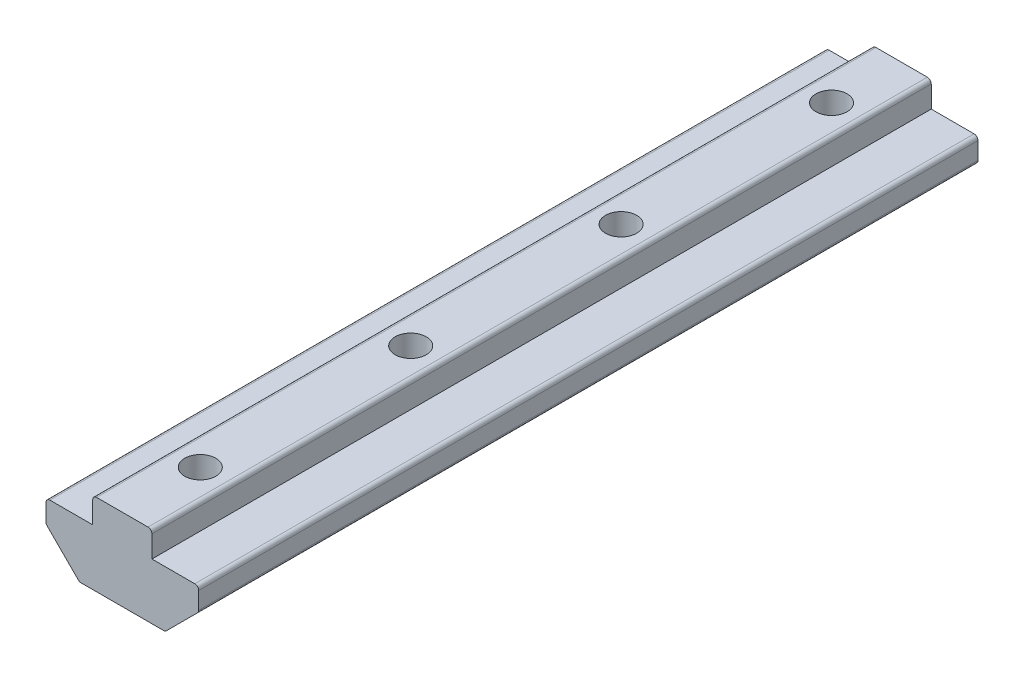
ISO-10303-21;
HEADER;
FILE_DESCRIPTION(('STEP AP214'),'2;1');
FILE_NAME('part.step','',(''),(''),'','','');
FILE_SCHEMA(('AUTOMOTIVE_DESIGN { 1 0 10303 214 1 1 1 1 }'));
ENDSEC;
DATA;
#1=APPLICATION_CONTEXT('core data for automotive mechanical design processes');
#2=APPLICATION_PROTOCOL_DEFINITION('international standard','automotive_design',2000,#1);
#3=PRODUCT_CONTEXT('',#1,'mechanical');
#4=PRODUCT('Part','Part','',(#3));
#5=PRODUCT_RELATED_PRODUCT_CATEGORY('part','',(#4));
#6=PRODUCT_DEFINITION_FORMATION('','',#4);
#7=PRODUCT_DEFINITION_CONTEXT('part definition',#1,'design');
#8=PRODUCT_DEFINITION('design','',#6,#7);
#9=PRODUCT_DEFINITION_SHAPE('','',#8);
#10=(LENGTH_UNIT() NAMED_UNIT(*) SI_UNIT(.MILLI.,.METRE.));
#11=(NAMED_UNIT(*) PLANE_ANGLE_UNIT() SI_UNIT($,.RADIAN.));
#12=(NAMED_UNIT(*) SI_UNIT($,.STERADIAN.) SOLID_ANGLE_UNIT());
#13=UNCERTAINTY_MEASURE_WITH_UNIT(LENGTH_MEASURE(1.E-05),#10,'distance_accuracy_value','');
#14=(GEOMETRIC_REPRESENTATION_CONTEXT(3) GLOBAL_UNCERTAINTY_ASSIGNED_CONTEXT((#13)) GLOBAL_UNIT_ASSIGNED_CONTEXT((#10,
#11,#12)) REPRESENTATION_CONTEXT('',''));
#15=CARTESIAN_POINT('',(0.,0.,0.));
#16=DIRECTION('',(0.,0.,1.));
#17=DIRECTION('',(1.,0.,0.));
#18=AXIS2_PLACEMENT_3D('',#15,#16,#17);
#19=CARTESIAN_POINT('',(19585.6814364039,-2632.55583535317,90.));
#20=DIRECTION('',(-5.38488611743923E-13,1.,0.));
#21=DIRECTION('',(-1.,-5.38488611743923E-13,0.));
#22=AXIS2_PLACEMENT_3D('',#19,#20,#21);
#23=CYLINDRICAL_SURFACE('',#22,2.00000000000001);
#24=CARTESIAN_POINT('',(19585.6814364008,3267.44416464683,90.));
#25=DIRECTION('',(-5.38488611743923E-13,1.,0.));
#26=DIRECTION('',(-1.,-5.38488611743923E-13,0.));
#27=AXIS2_PLACEMENT_3D('',#24,#25,#26);
#28=CIRCLE('',#27,2.00000000000001);
#29=CARTESIAN_POINT('',(19583.6814364008,3267.44416464683,90.));
#30=VERTEX_POINT('',#29);
#31=EDGE_CURVE('E64',#30,#30,#28,.T.);
#32=ORIENTED_EDGE('',*,*,#31,.T.);
#33=EDGE_LOOP('',(#32));
#34=FACE_BOUND('',#33,.T.);
#35=CARTESIAN_POINT('',(19585.6814364008,3256.94728629633,90.));
#36=DIRECTION('',(0.,1.,0.));
#37=DIRECTION('',(0.,0.,1.));
#38=AXIS2_PLACEMENT_3D('',#35,#36,#37);
#39=CIRCLE('',#38,2.00000000000001);
#40=CARTESIAN_POINT('',(19585.6814364008,3256.94728629633,92.));
#41=VERTEX_POINT('',#40);
#42=EDGE_CURVE('E11',#41,#41,#39,.T.);
#43=ORIENTED_EDGE('',*,*,#42,.F.);
#44=EDGE_LOOP('',(#43));
#45=FACE_BOUND('',#44,.T.);
#46=ADVANCED_FACE('F54',(#34,#45),#23,.F.);
#47=CARTESIAN_POINT('',(19585.6814364039,-2632.55583535317,63.));
#48=DIRECTION('',(-5.38488611743923E-13,1.,0.));
#49=DIRECTION('',(-1.,-5.38488611743923E-13,0.));
#50=AXIS2_PLACEMENT_3D('',#47,#48,#49);
#51=CYLINDRICAL_SURFACE('',#50,2.00000000000001);
#52=CARTESIAN_POINT('',(19585.6814364008,3267.44416464683,63.));
#53=DIRECTION('',(-5.38488611743923E-13,1.,0.));
#54=DIRECTION('',(-1.,-5.38488611743923E-13,0.));
#55=AXIS2_PLACEMENT_3D('',#52,#53,#54);
#56=CIRCLE('',#55,2.00000000000001);
#57=CARTESIAN_POINT('',(19583.6814364008,3267.44416464683,63.));
#58=VERTEX_POINT('',#57);
#59=EDGE_CURVE('E206',#58,#58,#56,.T.);
#60=ORIENTED_EDGE('',*,*,#59,.T.);
#61=EDGE_LOOP('',(#60));
#62=FACE_BOUND('',#61,.T.);
#63=CARTESIAN_POINT('',(19585.6814364008,3256.94728629633,63.));
#64=DIRECTION('',(0.,1.,0.));
#65=DIRECTION('',(0.,0.,1.));
#66=AXIS2_PLACEMENT_3D('',#63,#64,#65);
#67=CIRCLE('',#66,2.00000000000001);
#68=CARTESIAN_POINT('',(19585.6814364008,3256.94728629633,65.));
#69=VERTEX_POINT('',#68);
#70=EDGE_CURVE('E350',#69,#69,#67,.T.);
#71=ORIENTED_EDGE('',*,*,#70,.F.);
#72=EDGE_LOOP('',(#71));
#73=FACE_BOUND('',#72,.T.);
#74=ADVANCED_FACE('F380',(#62,#73),#51,.F.);
#75=CARTESIAN_POINT('',(19576.0309734432,3261.09459699045,6000.));
#76=DIRECTION('',(0.707106781186469,0.707106781186626,0.));
#77=DIRECTION('',(0.,0.,-1.));
#78=AXIS2_PLACEMENT_3D('',#75,#76,#77);
#79=PLANE('',#78);
#80=DIRECTION('',(0.707106781186626,-0.707106781186469,0.));
#81=VECTOR('',#80,1.);
#82=CARTESIAN_POINT('',(19576.0309734432,3261.09459699045,99.9999999999996));
#83=LINE('',#82,#81);
#84=CARTESIAN_POINT('',(19576.0309734432,3261.09459699045,99.9999999999996));
#85=VERTEX_POINT('',#84);
#86=CARTESIAN_POINT('',(19580.0318375278,3257.09373290574,99.9999999999996));
#87=VERTEX_POINT('',#86);
#88=EDGE_CURVE('E69',#85,#87,#83,.T.);
#89=ORIENTED_EDGE('',*,*,#88,.F.);
#90=DIRECTION('',(0.,0.,-1.));
#91=VECTOR('',#90,1.);
#92=CARTESIAN_POINT('',(19576.0309734432,3261.09459699045,6000.));
#93=LINE('',#92,#91);
#94=CARTESIAN_POINT('',(19576.0309734432,3261.09459699045,0.));
#95=VERTEX_POINT('',#94);
#96=EDGE_CURVE('E81',#85,#95,#93,.T.);
#97=ORIENTED_EDGE('',*,*,#96,.T.);
#98=DIRECTION('',(0.707106781186626,-0.707106781186469,0.));
#99=VECTOR('',#98,1.);
#100=CARTESIAN_POINT('',(19576.0309734432,3261.09459699045,0.));
#101=LINE('',#100,#99);
#102=CARTESIAN_POINT('',(19580.0318375278,3257.09373290574,0.));
#103=VERTEX_POINT('',#102);
#104=EDGE_CURVE('E210',#95,#103,#101,.T.);
#105=ORIENTED_EDGE('',*,*,#104,.T.);
#106=DIRECTION('',(0.,0.,-1.));
#107=VECTOR('',#106,1.);
#108=CARTESIAN_POINT('',(19580.0318375278,3257.09373290574,6000.));
#109=LINE('',#108,#107);
#110=EDGE_CURVE('E223',#87,#103,#109,.T.);
#111=ORIENTED_EDGE('',*,*,#110,.F.);
#112=EDGE_LOOP('',(#89,#97,#105,#111));
#113=FACE_BOUND('',#112,.T.);
#114=ADVANCED_FACE('F381',(#113),#79,.F.);
#115=CARTESIAN_POINT('',(19576.3845268337,3261.44815038103,6000.));
#116=DIRECTION('',(0.,0.,-1.));
#117=DIRECTION('',(-1.,0.,0.));
#118=AXIS2_PLACEMENT_3D('',#115,#116,#117);
#119=CYLINDRICAL_SURFACE('',#118,0.499999999956202);
#120=ORIENTED_EDGE('',*,*,#96,.F.);
#121=CARTESIAN_POINT('',(19576.3845268337,3261.44815038103,99.9999999999996));
#122=DIRECTION('',(0.,0.,1.));
#123=DIRECTION('',(1.,0.,0.));
#124=AXIS2_PLACEMENT_3D('',#121,#122,#123);
#125=CIRCLE('',#124,0.499999999956202);
#126=CARTESIAN_POINT('',(19575.8845268337,3261.44815038105,99.9999999999996));
#127=VERTEX_POINT('',#126);
#128=EDGE_CURVE('E748',#85,#127,#125,.F.);
#129=ORIENTED_EDGE('',*,*,#128,.T.);
#130=DIRECTION('',(0.,0.,-1.));
#131=VECTOR('',#130,1.);
#132=CARTESIAN_POINT('',(19575.8845268337,3261.44815038105,6000.));
#133=LINE('',#132,#131);
#134=CARTESIAN_POINT('',(19575.8845268337,3261.44815038105,0.));
#135=VERTEX_POINT('',#134);
#136=EDGE_CURVE('E334',#127,#135,#133,.T.);
#137=ORIENTED_EDGE('',*,*,#136,.T.);
#138=CARTESIAN_POINT('',(19576.3845268337,3261.44815038103,0.));
#139=DIRECTION('',(0.,0.,1.));
#140=DIRECTION('',(1.,0.,0.));
#141=AXIS2_PLACEMENT_3D('',#138,#139,#140);
#142=CIRCLE('',#141,0.499999999956202);
#143=EDGE_CURVE('E338',#135,#95,#142,.T.);
#144=ORIENTED_EDGE('',*,*,#143,.T.);
#145=EDGE_LOOP('',(#120,#129,#137,#144));
#146=FACE_BOUND('',#145,.T.);
#147=ADVANCED_FACE('F387',(#146),#119,.T.);
#148=CARTESIAN_POINT('',(19575.8845268337,3263.64506992518,6000.));
#149=DIRECTION('',(1.,0.,0.));
#150=DIRECTION('',(0.,1.,0.));
#151=AXIS2_PLACEMENT_3D('',#148,#149,#150);
#152=PLANE('',#151);
#153=DIRECTION('',(0.,-1.,0.));
#154=VECTOR('',#153,1.);
#155=CARTESIAN_POINT('',(19575.8845268337,3263.64506992518,99.9999999999996));
#156=LINE('',#155,#154);
#157=CARTESIAN_POINT('',(19575.8845268338,3263.64506992518,99.9999999999996));
#158=VERTEX_POINT('',#157);
#159=EDGE_CURVE('E750',#158,#127,#156,.T.);
#160=ORIENTED_EDGE('',*,*,#159,.F.);
#161=DIRECTION('',(0.,0.,-1.));
#162=VECTOR('',#161,1.);
#163=CARTESIAN_POINT('',(19575.8845268337,3263.64506992518,6000.));
#164=LINE('',#163,#162);
#165=CARTESIAN_POINT('',(19575.8845268337,3263.64506992518,0.));
#166=VERTEX_POINT('',#165);
#167=EDGE_CURVE('E326',#158,#166,#164,.T.);
#168=ORIENTED_EDGE('',*,*,#167,.T.);
#169=DIRECTION('',(0.,-1.,0.));
#170=VECTOR('',#169,1.);
#171=CARTESIAN_POINT('',(19575.8845268337,3263.64506992518,0.));
#172=LINE('',#171,#170);
#173=EDGE_CURVE('E328',#166,#135,#172,.T.);
#174=ORIENTED_EDGE('',*,*,#173,.T.);
#175=ORIENTED_EDGE('',*,*,#136,.F.);
#176=EDGE_LOOP('',(#160,#168,#174,#175));
#177=FACE_BOUND('',#176,.T.);
#178=ADVANCED_FACE('F398',(#177),#152,.F.);
#179=CARTESIAN_POINT('',(19576.3845268338,3263.64506992518,6000.));
#180=DIRECTION('',(0.,0.,-1.));
#181=DIRECTION('',(-1.,0.,0.));
#182=AXIS2_PLACEMENT_3D('',#179,#180,#181);
#183=CYLINDRICAL_SURFACE('',#182,0.499999999998835);
#184=ORIENTED_EDGE('',*,*,#167,.F.);
#185=CARTESIAN_POINT('',(19576.3845268338,3263.64506992518,99.9999999999996));
#186=DIRECTION('',(0.,0.,1.));
#187=DIRECTION('',(1.,0.,0.));
#188=AXIS2_PLACEMENT_3D('',#185,#186,#187);
#189=CIRCLE('',#188,0.499999999998835);
#190=CARTESIAN_POINT('',(19576.3845268338,3264.14506992518,99.9999999999996));
#191=VERTEX_POINT('',#190);
#192=EDGE_CURVE('E753',#158,#191,#189,.F.);
#193=ORIENTED_EDGE('',*,*,#192,.T.);
#194=DIRECTION('',(0.,0.,-1.));
#195=VECTOR('',#194,1.);
#196=CARTESIAN_POINT('',(19576.3845268338,3264.14506992518,6000.));
#197=LINE('',#196,#195);
#198=CARTESIAN_POINT('',(19576.3845268338,3264.14506992518,0.));
#199=VERTEX_POINT('',#198);
#200=EDGE_CURVE('E317',#191,#199,#197,.T.);
#201=ORIENTED_EDGE('',*,*,#200,.T.);
#202=CARTESIAN_POINT('',(19576.3845268338,3263.64506992518,0.));
#203=DIRECTION('',(0.,0.,1.));
#204=DIRECTION('',(1.,0.,0.));
#205=AXIS2_PLACEMENT_3D('',#202,#203,#204);
#206=CIRCLE('',#205,0.499999999998835);
#207=EDGE_CURVE('E325',#199,#166,#206,.T.);
#208=ORIENTED_EDGE('',*,*,#207,.T.);
#209=EDGE_LOOP('',(#184,#193,#201,#208));
#210=FACE_BOUND('',#209,.T.);
#211=ADVANCED_FACE('F397',(#210),#183,.T.);
#212=CARTESIAN_POINT('',(19581.8826538441,3264.14506992518,6000.));
#213=DIRECTION('',(0.,-1.,0.));
#214=DIRECTION('',(0.,0.,-1.));
#215=AXIS2_PLACEMENT_3D('',#212,#213,#214);
#216=PLANE('',#215);
#217=DIRECTION('',(-1.,0.,0.));
#218=VECTOR('',#217,1.);
#219=CARTESIAN_POINT('',(19581.8826538441,3264.14506992518,99.9999999999996));
#220=LINE('',#219,#218);
#221=CARTESIAN_POINT('',(19581.8826538441,3264.14506992518,99.9999999999996));
#222=VERTEX_POINT('',#221);
#223=EDGE_CURVE('E754',#222,#191,#220,.T.);
#224=ORIENTED_EDGE('',*,*,#223,.F.);
#225=DIRECTION('',(0.,0.,-1.));
#226=VECTOR('',#225,1.);
#227=CARTESIAN_POINT('',(19581.8826538441,3264.14506992518,6000.));
#228=LINE('',#227,#226);
#229=CARTESIAN_POINT('',(19581.8826538441,3264.14506992518,0.));
#230=VERTEX_POINT('',#229);
#231=EDGE_CURVE('E315',#222,#230,#228,.T.);
#232=ORIENTED_EDGE('',*,*,#231,.T.);
#233=DIRECTION('',(-1.,0.,0.));
#234=VECTOR('',#233,1.);
#235=CARTESIAN_POINT('',(19581.8826538441,3264.14506992518,0.));
#236=LINE('',#235,#234);
#237=EDGE_CURVE('E312',#230,#199,#236,.T.);
#238=ORIENTED_EDGE('',*,*,#237,.T.);
#239=ORIENTED_EDGE('',*,*,#200,.F.);
#240=EDGE_LOOP('',(#224,#232,#238,#239));
#241=FACE_BOUND('',#240,.T.);
#242=ADVANCED_FACE('F396',(#241),#216,.F.);
#243=CARTESIAN_POINT('',(19581.8826538441,3266.94416464683,6000.));
#244=DIRECTION('',(1.,0.,0.));
#245=DIRECTION('',(0.,1.,0.));
#246=AXIS2_PLACEMENT_3D('',#243,#244,#245);
#247=PLANE('',#246);
#248=DIRECTION('',(0.,-1.,0.));
#249=VECTOR('',#248,1.);
#250=CARTESIAN_POINT('',(19581.8826538441,3266.94416464683,99.9999999999996));
#251=LINE('',#250,#249);
#252=CARTESIAN_POINT('',(19581.8826538441,3266.94416464683,99.9999999999996));
#253=VERTEX_POINT('',#252);
#254=EDGE_CURVE('E756',#253,#222,#251,.T.);
#255=ORIENTED_EDGE('',*,*,#254,.F.);
#256=DIRECTION('',(0.,0.,-1.));
#257=VECTOR('',#256,1.);
#258=CARTESIAN_POINT('',(19581.8826538441,3266.94416464683,6000.));
#259=LINE('',#258,#257);
#260=CARTESIAN_POINT('',(19581.8826538441,3266.94416464683,0.));
#261=VERTEX_POINT('',#260);
#262=EDGE_CURVE('E305',#253,#261,#259,.T.);
#263=ORIENTED_EDGE('',*,*,#262,.T.);
#264=DIRECTION('',(0.,-1.,0.));
#265=VECTOR('',#264,1.);
#266=CARTESIAN_POINT('',(19581.8826538441,3266.94416464683,0.));
#267=LINE('',#266,#265);
#268=EDGE_CURVE('E306',#261,#230,#267,.T.);
#269=ORIENTED_EDGE('',*,*,#268,.T.);
#270=ORIENTED_EDGE('',*,*,#231,.F.);
#271=EDGE_LOOP('',(#255,#263,#269,#270));
#272=FACE_BOUND('',#271,.T.);
#273=ADVANCED_FACE('F369',(#272),#247,.F.);
#274=CARTESIAN_POINT('',(19582.3826538441,3266.94416464683,6000.));
#275=DIRECTION('',(0.,0.,-1.));
#276=DIRECTION('',(-1.,0.,0.));
#277=AXIS2_PLACEMENT_3D('',#274,#275,#276);
#278=CYLINDRICAL_SURFACE('',#277,0.499999999998835);
#279=ORIENTED_EDGE('',*,*,#262,.F.);
#280=CARTESIAN_POINT('',(19582.3826538441,3266.94416464683,99.9999999999996));
#281=DIRECTION('',(0.,0.,1.));
#282=DIRECTION('',(1.,0.,0.));
#283=AXIS2_PLACEMENT_3D('',#280,#281,#282);
#284=CIRCLE('',#283,0.499999999998835);
#285=CARTESIAN_POINT('',(19582.3826538441,3267.44416464683,99.9999999999996));
#286=VERTEX_POINT('',#285);
#287=EDGE_CURVE('E758',#253,#286,#284,.F.);
#288=ORIENTED_EDGE('',*,*,#287,.T.);
#289=DIRECTION('',(0.,0.,-1.));
#290=VECTOR('',#289,1.);
#291=CARTESIAN_POINT('',(19582.3826538441,3267.44416464683,6000.));
#292=LINE('',#291,#290);
#293=CARTESIAN_POINT('',(19582.3826538441,3267.44416464683,0.));
#294=VERTEX_POINT('',#293);
#295=EDGE_CURVE('E297',#286,#294,#292,.T.);
#296=ORIENTED_EDGE('',*,*,#295,.T.);
#297=CARTESIAN_POINT('',(19582.3826538441,3266.94416464683,0.));
#298=DIRECTION('',(0.,0.,1.));
#299=DIRECTION('',(1.,0.,0.));
#300=AXIS2_PLACEMENT_3D('',#297,#298,#299);
#301=CIRCLE('',#300,0.499999999998835);
#302=EDGE_CURVE('E301',#294,#261,#301,.T.);
#303=ORIENTED_EDGE('',*,*,#302,.T.);
#304=EDGE_LOOP('',(#279,#288,#296,#303));
#305=FACE_BOUND('',#304,.T.);
#306=ADVANCED_FACE('F357',(#305),#278,.T.);
#307=CARTESIAN_POINT('',(19588.9802189574,3267.44416464683,6000.));
#308=DIRECTION('',(5.38488611743923E-13,-1.,0.));
#309=DIRECTION('',(0.,0.,-1.));
#310=AXIS2_PLACEMENT_3D('',#307,#308,#309);
#311=PLANE('',#310);
#312=CARTESIAN_POINT('',(19585.6814364008,3267.44416464683,36.));
#313=DIRECTION('',(-5.38488611743923E-13,1.,0.));
#314=DIRECTION('',(-1.,-5.38488611743923E-13,0.));
#315=AXIS2_PLACEMENT_3D('',#312,#313,#314);
#316=CIRCLE('',#315,2.00000000000001);
#317=CARTESIAN_POINT('',(19583.6814364008,3267.44416464683,36.));
#318=VERTEX_POINT('',#317);
#319=EDGE_CURVE('E787',#318,#318,#316,.T.);
#320=ORIENTED_EDGE('',*,*,#319,.F.);
#321=EDGE_LOOP('',(#320));
#322=FACE_BOUND('',#321,.T.);
#323=CARTESIAN_POINT('',(19585.6814364008,3267.44416464683,9.));
#324=DIRECTION('',(-5.38488611743923E-13,1.,0.));
#325=DIRECTION('',(-1.,-5.38488611743923E-13,0.));
#326=AXIS2_PLACEMENT_3D('',#323,#324,#325);
#327=CIRCLE('',#326,2.00000000000001);
#328=CARTESIAN_POINT('',(19583.6814364008,3267.44416464683,9.));
#329=VERTEX_POINT('',#328);
#330=EDGE_CURVE('E344',#329,#329,#327,.T.);
#331=ORIENTED_EDGE('',*,*,#330,.F.);
#332=EDGE_LOOP('',(#331));
#333=FACE_BOUND('',#332,.T.);
#334=DIRECTION('',(-1.,-5.38488611743923E-13,0.));
#335=VECTOR('',#334,1.);
#336=CARTESIAN_POINT('',(19588.9802189574,3267.44416464683,99.9999999999996));
#337=LINE('',#336,#335);
#338=CARTESIAN_POINT('',(19588.9802189574,3267.44416464683,99.9999999999996));
#339=VERTEX_POINT('',#338);
#340=EDGE_CURVE('E761',#339,#286,#337,.T.);
#341=ORIENTED_EDGE('',*,*,#340,.F.);
#342=DIRECTION('',(0.,0.,-1.));
#343=VECTOR('',#342,1.);
#344=CARTESIAN_POINT('',(19588.9802189574,3267.44416464683,6000.));
#345=LINE('',#344,#343);
#346=CARTESIAN_POINT('',(19588.9802189574,3267.44416464683,0.));
#347=VERTEX_POINT('',#346);
#348=EDGE_CURVE('E274',#339,#347,#345,.T.);
#349=ORIENTED_EDGE('',*,*,#348,.T.);
#350=DIRECTION('',(-1.,-5.38488611743923E-13,0.));
#351=VECTOR('',#350,1.);
#352=CARTESIAN_POINT('',(19588.9802189574,3267.44416464683,0.));
#353=LINE('',#352,#351);
#354=EDGE_CURVE('E279',#347,#294,#353,.T.);
#355=ORIENTED_EDGE('',*,*,#354,.T.);
#356=ORIENTED_EDGE('',*,*,#295,.F.);
#357=EDGE_LOOP('',(#341,#349,#355,#356));
#358=FACE_BOUND('',#357,.T.);
#359=ORIENTED_EDGE('',*,*,#59,.F.);
#360=EDGE_LOOP('',(#359));
#361=FACE_BOUND('',#360,.T.);
#362=ORIENTED_EDGE('',*,*,#31,.F.);
#363=EDGE_LOOP('',(#362));
#364=FACE_BOUND('',#363,.T.);
#365=ADVANCED_FACE('F355',(#322,#333,#358,#361,#364),#311,.F.);
#366=CARTESIAN_POINT('',(19588.9802189574,3266.94416464683,6000.));
#367=DIRECTION('',(0.,0.,-1.));
#368=DIRECTION('',(-1.,0.,0.));
#369=AXIS2_PLACEMENT_3D('',#366,#367,#368);
#370=CYLINDRICAL_SURFACE('',#369,0.499999999998835);
#371=ORIENTED_EDGE('',*,*,#348,.F.);
#372=CARTESIAN_POINT('',(19588.9802189574,3266.94416464683,99.9999999999996));
#373=DIRECTION('',(0.,0.,1.));
#374=DIRECTION('',(1.,0.,0.));
#375=AXIS2_PLACEMENT_3D('',#372,#373,#374);
#376=CIRCLE('',#375,0.499999999998835);
#377=CARTESIAN_POINT('',(19589.4802189575,3266.94416464683,99.9999999999996));
#378=VERTEX_POINT('',#377);
#379=EDGE_CURVE('E763',#339,#378,#376,.F.);
#380=ORIENTED_EDGE('',*,*,#379,.T.);
#381=DIRECTION('',(0.,0.,-1.));
#382=VECTOR('',#381,1.);
#383=CARTESIAN_POINT('',(19589.4802189575,3266.94416464683,6000.));
#384=LINE('',#383,#382);
#385=CARTESIAN_POINT('',(19589.4802189575,3266.94416464683,0.));
#386=VERTEX_POINT('',#385);
#387=EDGE_CURVE('E287',#378,#386,#384,.T.);
#388=ORIENTED_EDGE('',*,*,#387,.T.);
#389=CARTESIAN_POINT('',(19588.9802189574,3266.94416464683,0.));
#390=DIRECTION('',(0.,0.,1.));
#391=DIRECTION('',(1.,0.,0.));
#392=AXIS2_PLACEMENT_3D('',#389,#390,#391);
#393=CIRCLE('',#392,0.499999999998835);
#394=EDGE_CURVE('E276',#386,#347,#393,.T.);
#395=ORIENTED_EDGE('',*,*,#394,.T.);
#396=EDGE_LOOP('',(#371,#380,#388,#395));
#397=FACE_BOUND('',#396,.T.);
#398=ADVANCED_FACE('F356',(#397),#370,.T.);
#399=CARTESIAN_POINT('',(19589.4802189575,3264.14506992518,6000.));
#400=DIRECTION('',(-1.,0.,0.));
#401=DIRECTION('',(0.,0.,1.));
#402=AXIS2_PLACEMENT_3D('',#399,#400,#401);
#403=PLANE('',#402);
#404=DIRECTION('',(0.,1.,0.));
#405=VECTOR('',#404,1.);
#406=CARTESIAN_POINT('',(19589.4802189575,3264.14506992518,99.9999999999996));
#407=LINE('',#406,#405);
#408=CARTESIAN_POINT('',(19589.4802189575,3264.14506992518,99.9999999999996));
#409=VERTEX_POINT('',#408);
#410=EDGE_CURVE('E766',#409,#378,#407,.T.);
#411=ORIENTED_EDGE('',*,*,#410,.F.);
#412=DIRECTION('',(0.,0.,-1.));
#413=VECTOR('',#412,1.);
#414=CARTESIAN_POINT('',(19589.4802189575,3264.14506992518,6000.));
#415=LINE('',#414,#413);
#416=CARTESIAN_POINT('',(19589.4802189575,3264.14506992518,0.));
#417=VERTEX_POINT('',#416);
#418=EDGE_CURVE('E282',#409,#417,#415,.T.);
#419=ORIENTED_EDGE('',*,*,#418,.T.);
#420=DIRECTION('',(0.,1.,0.));
#421=VECTOR('',#420,1.);
#422=CARTESIAN_POINT('',(19589.4802189575,3264.14506992518,0.));
#423=LINE('',#422,#421);
#424=EDGE_CURVE('E288',#417,#386,#423,.T.);
#425=ORIENTED_EDGE('',*,*,#424,.T.);
#426=ORIENTED_EDGE('',*,*,#387,.F.);
#427=EDGE_LOOP('',(#411,#419,#425,#426));
#428=FACE_BOUND('',#427,.T.);
#429=ADVANCED_FACE('F364',(#428),#403,.F.);
#430=CARTESIAN_POINT('',(19594.9783459677,3264.14506992519,6000.));
#431=DIRECTION('',(6.46167989961607E-13,-1.,0.));
#432=DIRECTION('',(0.,0.,-1.));
#433=AXIS2_PLACEMENT_3D('',#430,#431,#432);
#434=PLANE('',#433);
#435=DIRECTION('',(-1.,-6.46167989961607E-13,0.));
#436=VECTOR('',#435,1.);
#437=CARTESIAN_POINT('',(19594.9783459677,3264.14506992519,99.9999999999996));
#438=LINE('',#437,#436);
#439=CARTESIAN_POINT('',(19594.9783459677,3264.14506992518,99.9999999999996));
#440=VERTEX_POINT('',#439);
#441=EDGE_CURVE('E767',#440,#409,#438,.T.);
#442=ORIENTED_EDGE('',*,*,#441,.F.);
#443=DIRECTION('',(0.,0.,-1.));
#444=VECTOR('',#443,1.);
#445=CARTESIAN_POINT('',(19594.9783459677,3264.14506992519,6000.));
#446=LINE('',#445,#444);
#447=CARTESIAN_POINT('',(19594.9783459677,3264.14506992519,0.));
#448=VERTEX_POINT('',#447);
#449=EDGE_CURVE('E256',#440,#448,#446,.T.);
#450=ORIENTED_EDGE('',*,*,#449,.T.);
#451=DIRECTION('',(-1.,-6.46167989961607E-13,0.));
#452=VECTOR('',#451,1.);
#453=CARTESIAN_POINT('',(19594.9783459677,3264.14506992519,0.));
#454=LINE('',#453,#452);
#455=EDGE_CURVE('E261',#448,#417,#454,.T.);
#456=ORIENTED_EDGE('',*,*,#455,.T.);
#457=ORIENTED_EDGE('',*,*,#418,.F.);
#458=EDGE_LOOP('',(#442,#450,#456,#457));
#459=FACE_BOUND('',#458,.T.);
#460=ADVANCED_FACE('F401',(#459),#434,.F.);
#461=CARTESIAN_POINT('',(19594.9783459677,3263.64506992518,6000.));
#462=DIRECTION('',(0.,0.,-1.));
#463=DIRECTION('',(-1.,0.,0.));
#464=AXIS2_PLACEMENT_3D('',#461,#462,#463);
#465=CYLINDRICAL_SURFACE('',#464,0.499999999998835);
#466=ORIENTED_EDGE('',*,*,#449,.F.);
#467=CARTESIAN_POINT('',(19594.9783459677,3263.64506992518,99.9999999999996));
#468=DIRECTION('',(0.,0.,1.));
#469=DIRECTION('',(1.,0.,0.));
#470=AXIS2_PLACEMENT_3D('',#467,#468,#469);
#471=CIRCLE('',#470,0.499999999998835);
#472=CARTESIAN_POINT('',(19595.4783459677,3263.64506992518,99.9999999999996));
#473=VERTEX_POINT('',#472);
#474=EDGE_CURVE('E769',#440,#473,#471,.F.);
#475=ORIENTED_EDGE('',*,*,#474,.T.);
#476=DIRECTION('',(0.,0.,-1.));
#477=VECTOR('',#476,1.);
#478=CARTESIAN_POINT('',(19595.4783459677,3263.64506992518,6000.));
#479=LINE('',#478,#477);
#480=CARTESIAN_POINT('',(19595.4783459677,3263.64506992518,0.));
#481=VERTEX_POINT('',#480);
#482=EDGE_CURVE('E267',#473,#481,#479,.T.);
#483=ORIENTED_EDGE('',*,*,#482,.T.);
#484=CARTESIAN_POINT('',(19594.9783459677,3263.64506992518,0.));
#485=DIRECTION('',(0.,0.,1.));
#486=DIRECTION('',(1.,0.,0.));
#487=AXIS2_PLACEMENT_3D('',#484,#485,#486);
#488=CIRCLE('',#487,0.499999999998835);
#489=EDGE_CURVE('E265',#481,#448,#488,.T.);
#490=ORIENTED_EDGE('',*,*,#489,.T.);
#491=EDGE_LOOP('',(#466,#475,#483,#490));
#492=FACE_BOUND('',#491,.T.);
#493=ADVANCED_FACE('F408',(#492),#465,.T.);
#494=CARTESIAN_POINT('',(19595.4783459677,3261.44815038105,6000.));
#495=DIRECTION('',(-1.,0.,0.));
#496=DIRECTION('',(0.,0.,1.));
#497=AXIS2_PLACEMENT_3D('',#494,#495,#496);
#498=PLANE('',#497);
#499=DIRECTION('',(0.,1.,0.));
#500=VECTOR('',#499,1.);
#501=CARTESIAN_POINT('',(19595.4783459677,3261.44815038105,99.9999999999996));
#502=LINE('',#501,#500);
#503=CARTESIAN_POINT('',(19595.4783459677,3261.44815038103,99.9999999999996));
#504=VERTEX_POINT('',#503);
#505=EDGE_CURVE('E774',#504,#473,#502,.T.);
#506=ORIENTED_EDGE('',*,*,#505,.F.);
#507=DIRECTION('',(0.,0.,-1.));
#508=VECTOR('',#507,1.);
#509=CARTESIAN_POINT('',(19595.4783459677,3261.44815038105,6000.));
#510=LINE('',#509,#508);
#511=CARTESIAN_POINT('',(19595.4783459677,3261.44815038105,0.));
#512=VERTEX_POINT('',#511);
#513=EDGE_CURVE('E248',#504,#512,#510,.T.);
#514=ORIENTED_EDGE('',*,*,#513,.T.);
#515=DIRECTION('',(0.,1.,0.));
#516=VECTOR('',#515,1.);
#517=CARTESIAN_POINT('',(19595.4783459677,3261.44815038105,0.));
#518=LINE('',#517,#516);
#519=EDGE_CURVE('E252',#512,#481,#518,.T.);
#520=ORIENTED_EDGE('',*,*,#519,.T.);
#521=ORIENTED_EDGE('',*,*,#482,.F.);
#522=EDGE_LOOP('',(#506,#514,#520,#521));
#523=FACE_BOUND('',#522,.T.);
#524=ADVANCED_FACE('F407',(#523),#498,.F.);
#525=CARTESIAN_POINT('',(19594.9783459677,3261.44815038103,6000.));
#526=DIRECTION('',(0.,0.,-1.));
#527=DIRECTION('',(-1.,0.,0.));
#528=AXIS2_PLACEMENT_3D('',#525,#526,#527);
#529=CYLINDRICAL_SURFACE('',#528,0.499999999970413);
#530=ORIENTED_EDGE('',*,*,#513,.F.);
#531=CARTESIAN_POINT('',(19594.9783459677,3261.44815038103,99.9999999999996));
#532=DIRECTION('',(0.,0.,1.));
#533=DIRECTION('',(1.,0.,0.));
#534=AXIS2_PLACEMENT_3D('',#531,#532,#533);
#535=CIRCLE('',#534,0.499999999970413);
#536=CARTESIAN_POINT('',(19595.3318993583,3261.09459699044,99.9999999999996));
#537=VERTEX_POINT('',#536);
#538=EDGE_CURVE('E773',#504,#537,#535,.F.);
#539=ORIENTED_EDGE('',*,*,#538,.T.);
#540=DIRECTION('',(0.,0.,-1.));
#541=VECTOR('',#540,1.);
#542=CARTESIAN_POINT('',(19595.3318993583,3261.09459699045,6000.));
#543=LINE('',#542,#541);
#544=CARTESIAN_POINT('',(19595.3318993583,3261.09459699045,0.));
#545=VERTEX_POINT('',#544);
#546=EDGE_CURVE('E239',#537,#545,#543,.T.);
#547=ORIENTED_EDGE('',*,*,#546,.T.);
#548=CARTESIAN_POINT('',(19594.9783459677,3261.44815038103,0.));
#549=DIRECTION('',(0.,0.,1.));
#550=DIRECTION('',(1.,0.,0.));
#551=AXIS2_PLACEMENT_3D('',#548,#549,#550);
#552=CIRCLE('',#551,0.499999999970413);
#553=EDGE_CURVE('E251',#545,#512,#552,.T.);
#554=ORIENTED_EDGE('',*,*,#553,.T.);
#555=EDGE_LOOP('',(#530,#539,#547,#554));
#556=FACE_BOUND('',#555,.T.);
#557=ADVANCED_FACE('F411',(#556),#529,.T.);
#558=CARTESIAN_POINT('',(19591.3310352737,3257.09373290574,6000.));
#559=DIRECTION('',(-0.707106781186312,0.707106781186783,0.));
#560=DIRECTION('',(0.,0.,1.));
#561=AXIS2_PLACEMENT_3D('',#558,#559,#560);
#562=PLANE('',#561);
#563=DIRECTION('',(0.707106781186783,0.707106781186312,0.));
#564=VECTOR('',#563,1.);
#565=CARTESIAN_POINT('',(19591.3310352737,3257.09373290574,99.9999999999996));
#566=LINE('',#565,#564);
#567=CARTESIAN_POINT('',(19591.3310352737,3257.09373290575,99.9999999999996));
#568=VERTEX_POINT('',#567);
#569=EDGE_CURVE('E777',#568,#537,#566,.T.);
#570=ORIENTED_EDGE('',*,*,#569,.F.);
#571=DIRECTION('',(0.,0.,-1.));
#572=VECTOR('',#571,1.);
#573=CARTESIAN_POINT('',(19591.3310352737,3257.09373290574,6000.));
#574=LINE('',#573,#572);
#575=CARTESIAN_POINT('',(19591.3310352737,3257.09373290574,0.));
#576=VERTEX_POINT('',#575);
#577=EDGE_CURVE('E238',#568,#576,#574,.T.);
#578=ORIENTED_EDGE('',*,*,#577,.T.);
#579=DIRECTION('',(0.707106781186783,0.707106781186312,0.));
#580=VECTOR('',#579,1.);
#581=CARTESIAN_POINT('',(19591.3310352737,3257.09373290574,0.));
#582=LINE('',#581,#580);
#583=EDGE_CURVE('E232',#576,#545,#582,.T.);
#584=ORIENTED_EDGE('',*,*,#583,.T.);
#585=ORIENTED_EDGE('',*,*,#546,.F.);
#586=EDGE_LOOP('',(#570,#578,#584,#585));
#587=FACE_BOUND('',#586,.T.);
#588=ADVANCED_FACE('F423',(#587),#562,.F.);
#589=CARTESIAN_POINT('',(19590.977481883,3257.44728629634,6000.));
#590=DIRECTION('',(0.,0.,-1.));
#591=DIRECTION('',(-1.,0.,0.));
#592=AXIS2_PLACEMENT_3D('',#589,#590,#591);
#593=CYLINDRICAL_SURFACE('',#592,0.50000000000594);
#594=ORIENTED_EDGE('',*,*,#577,.F.);
#595=CARTESIAN_POINT('',(19590.977481883,3257.44728629634,99.9999999999996));
#596=DIRECTION('',(0.,0.,1.));
#597=DIRECTION('',(1.,0.,0.));
#598=AXIS2_PLACEMENT_3D('',#595,#596,#597);
#599=CIRCLE('',#598,0.50000000000594);
#600=CARTESIAN_POINT('',(19590.977481883,3256.94728629633,99.9999999999996));
#601=VERTEX_POINT('',#600);
#602=EDGE_CURVE('E220',#568,#601,#599,.F.);
#603=ORIENTED_EDGE('',*,*,#602,.T.);
#604=DIRECTION('',(0.,0.,-1.));
#605=VECTOR('',#604,1.);
#606=CARTESIAN_POINT('',(19590.977481883,3256.94728629633,6000.));
#607=LINE('',#606,#605);
#608=CARTESIAN_POINT('',(19590.977481883,3256.94728629633,0.));
#609=VERTEX_POINT('',#608);
#610=EDGE_CURVE('E216',#601,#609,#607,.T.);
#611=ORIENTED_EDGE('',*,*,#610,.T.);
#612=CARTESIAN_POINT('',(19590.977481883,3257.44728629634,0.));
#613=DIRECTION('',(0.,0.,1.));
#614=DIRECTION('',(1.,0.,0.));
#615=AXIS2_PLACEMENT_3D('',#612,#613,#614);
#616=CIRCLE('',#615,0.50000000000594);
#617=EDGE_CURVE('E243',#609,#576,#616,.T.);
#618=ORIENTED_EDGE('',*,*,#617,.T.);
#619=EDGE_LOOP('',(#594,#603,#611,#618));
#620=FACE_BOUND('',#619,.T.);
#621=ADVANCED_FACE('F428',(#620),#593,.T.);
#622=CARTESIAN_POINT('',(19580.3853909185,3256.94728629633,6000.));
#623=DIRECTION('',(0.,1.,0.));
#624=DIRECTION('',(1.,0.,0.));
#625=AXIS2_PLACEMENT_3D('',#622,#623,#624);
#626=PLANE('',#625);
#627=CARTESIAN_POINT('',(19585.6814364008,3256.94728629633,36.));
#628=DIRECTION('',(0.,1.,0.));
#629=DIRECTION('',(0.,0.,1.));
#630=AXIS2_PLACEMENT_3D('',#627,#628,#629);
#631=CIRCLE('',#630,2.00000000000001);
#632=CARTESIAN_POINT('',(19585.6814364008,3256.94728629633,38.));
#633=VERTEX_POINT('',#632);
#634=EDGE_CURVE('E781',#633,#633,#631,.T.);
#635=ORIENTED_EDGE('',*,*,#634,.T.);
#636=EDGE_LOOP('',(#635));
#637=FACE_BOUND('',#636,.T.);
#638=CARTESIAN_POINT('',(19585.6814364008,3256.94728629633,9.));
#639=DIRECTION('',(0.,1.,0.));
#640=DIRECTION('',(0.,0.,1.));
#641=AXIS2_PLACEMENT_3D('',#638,#639,#640);
#642=CIRCLE('',#641,2.00000000000001);
#643=CARTESIAN_POINT('',(19585.6814364008,3256.94728629633,11.));
#644=VERTEX_POINT('',#643);
#645=EDGE_CURVE('E217',#644,#644,#642,.T.);
#646=ORIENTED_EDGE('',*,*,#645,.T.);
#647=EDGE_LOOP('',(#646));
#648=FACE_BOUND('',#647,.T.);
#649=DIRECTION('',(1.,0.,0.));
#650=VECTOR('',#649,1.);
#651=CARTESIAN_POINT('',(19580.3853909185,3256.94728629633,99.9999999999996));
#652=LINE('',#651,#650);
#653=CARTESIAN_POINT('',(19580.3853909185,3256.94728629634,99.9999999999996));
#654=VERTEX_POINT('',#653);
#655=EDGE_CURVE('E203',#654,#601,#652,.T.);
#656=ORIENTED_EDGE('',*,*,#655,.F.);
#657=DIRECTION('',(0.,0.,-1.));
#658=VECTOR('',#657,1.);
#659=CARTESIAN_POINT('',(19580.3853909185,3256.94728629633,6000.));
#660=LINE('',#659,#658);
#661=CARTESIAN_POINT('',(19580.3853909185,3256.94728629633,0.));
#662=VERTEX_POINT('',#661);
#663=EDGE_CURVE('E212',#654,#662,#660,.T.);
#664=ORIENTED_EDGE('',*,*,#663,.T.);
#665=DIRECTION('',(1.,0.,0.));
#666=VECTOR('',#665,1.);
#667=CARTESIAN_POINT('',(19580.3853909185,3256.94728629633,0.));
#668=LINE('',#667,#666);
#669=EDGE_CURVE('E230',#662,#609,#668,.T.);
#670=ORIENTED_EDGE('',*,*,#669,.T.);
#671=ORIENTED_EDGE('',*,*,#610,.F.);
#672=EDGE_LOOP('',(#656,#664,#670,#671));
#673=FACE_BOUND('',#672,.T.);
#674=ORIENTED_EDGE('',*,*,#70,.T.);
#675=EDGE_LOOP('',(#674));
#676=FACE_BOUND('',#675,.T.);
#677=ORIENTED_EDGE('',*,*,#42,.T.);
#678=EDGE_LOOP('',(#677));
#679=FACE_BOUND('',#678,.T.);
#680=ADVANCED_FACE('F211',(#637,#648,#673,#676,#679),#626,.F.);
#681=CARTESIAN_POINT('',(19580.3853909185,3257.44728629632,6000.));
#682=DIRECTION('',(0.,0.,-1.));
#683=DIRECTION('',(-1.,0.,0.));
#684=AXIS2_PLACEMENT_3D('',#681,#682,#683);
#685=CYLINDRICAL_SURFACE('',#684,0.499999999981071);
#686=ORIENTED_EDGE('',*,*,#663,.F.);
#687=CARTESIAN_POINT('',(19580.3853909185,3257.44728629632,99.9999999999996));
#688=DIRECTION('',(0.,0.,1.));
#689=DIRECTION('',(1.,0.,0.));
#690=AXIS2_PLACEMENT_3D('',#687,#688,#689);
#691=CIRCLE('',#690,0.499999999981071);
#692=EDGE_CURVE('E196',#654,#87,#691,.F.);
#693=ORIENTED_EDGE('',*,*,#692,.T.);
#694=ORIENTED_EDGE('',*,*,#110,.T.);
#695=CARTESIAN_POINT('',(19580.3853909185,3257.44728629632,0.));
#696=DIRECTION('',(0.,0.,1.));
#697=DIRECTION('',(1.,0.,0.));
#698=AXIS2_PLACEMENT_3D('',#695,#696,#697);
#699=CIRCLE('',#698,0.499999999981071);
#700=EDGE_CURVE('E224',#103,#662,#699,.T.);
#701=ORIENTED_EDGE('',*,*,#700,.T.);
#702=EDGE_LOOP('',(#686,#693,#694,#701));
#703=FACE_BOUND('',#702,.T.);
#704=ADVANCED_FACE('F222',(#703),#685,.T.);
#705=CARTESIAN_POINT('',(19580.3853909185,3257.44728629632,0.));
#706=DIRECTION('',(0.,0.,1.));
#707=DIRECTION('',(1.,0.,0.));
#708=AXIS2_PLACEMENT_3D('',#705,#706,#707);
#709=PLANE('',#708);
#710=ORIENTED_EDGE('',*,*,#700,.F.);
#711=ORIENTED_EDGE('',*,*,#104,.F.);
#712=ORIENTED_EDGE('',*,*,#143,.F.);
#713=ORIENTED_EDGE('',*,*,#173,.F.);
#714=ORIENTED_EDGE('',*,*,#207,.F.);
#715=ORIENTED_EDGE('',*,*,#237,.F.);
#716=ORIENTED_EDGE('',*,*,#268,.F.);
#717=ORIENTED_EDGE('',*,*,#302,.F.);
#718=ORIENTED_EDGE('',*,*,#354,.F.);
#719=ORIENTED_EDGE('',*,*,#394,.F.);
#720=ORIENTED_EDGE('',*,*,#424,.F.);
#721=ORIENTED_EDGE('',*,*,#455,.F.);
#722=ORIENTED_EDGE('',*,*,#489,.F.);
#723=ORIENTED_EDGE('',*,*,#519,.F.);
#724=ORIENTED_EDGE('',*,*,#553,.F.);
#725=ORIENTED_EDGE('',*,*,#583,.F.);
#726=ORIENTED_EDGE('',*,*,#617,.F.);
#727=ORIENTED_EDGE('',*,*,#669,.F.);
#728=EDGE_LOOP('',(#710,#711,#712,#713,#714,#715,#716,#717,#718,#719,#720,#721,#722,#723,#724,
#725,#726,#727));
#729=FACE_BOUND('',#728,.T.);
#730=ADVANCED_FACE('F388',(#729),#709,.F.);
#731=CARTESIAN_POINT('',(19585.8255876053,3261.98579907653,99.9999999999996));
#732=DIRECTION('',(0.,0.,1.));
#733=DIRECTION('',(1.,0.,0.));
#734=AXIS2_PLACEMENT_3D('',#731,#732,#733);
#735=PLANE('',#734);
#736=ORIENTED_EDGE('',*,*,#88,.T.);
#737=ORIENTED_EDGE('',*,*,#692,.F.);
#738=ORIENTED_EDGE('',*,*,#655,.T.);
#739=ORIENTED_EDGE('',*,*,#602,.F.);
#740=ORIENTED_EDGE('',*,*,#569,.T.);
#741=ORIENTED_EDGE('',*,*,#538,.F.);
#742=ORIENTED_EDGE('',*,*,#505,.T.);
#743=ORIENTED_EDGE('',*,*,#474,.F.);
#744=ORIENTED_EDGE('',*,*,#441,.T.);
#745=ORIENTED_EDGE('',*,*,#410,.T.);
#746=ORIENTED_EDGE('',*,*,#379,.F.);
#747=ORIENTED_EDGE('',*,*,#340,.T.);
#748=ORIENTED_EDGE('',*,*,#287,.F.);
#749=ORIENTED_EDGE('',*,*,#254,.T.);
#750=ORIENTED_EDGE('',*,*,#223,.T.);
#751=ORIENTED_EDGE('',*,*,#192,.F.);
#752=ORIENTED_EDGE('',*,*,#159,.T.);
#753=ORIENTED_EDGE('',*,*,#128,.F.);
#754=EDGE_LOOP('',(#736,#737,#738,#739,#740,#741,#742,#743,#744,#745,#746,#747,#748,#749,#750,
#751,#752,#753));
#755=FACE_BOUND('',#754,.T.);
#756=ADVANCED_FACE('F199',(#755),#735,.T.);
#757=CARTESIAN_POINT('',(19585.6814364039,-2632.55583535317,9.));
#758=DIRECTION('',(-5.38488611743923E-13,1.,0.));
#759=DIRECTION('',(-1.,-5.38488611743923E-13,0.));
#760=AXIS2_PLACEMENT_3D('',#757,#758,#759);
#761=CYLINDRICAL_SURFACE('',#760,2.00000000000001);
#762=ORIENTED_EDGE('',*,*,#330,.T.);
#763=EDGE_LOOP('',(#762));
#764=FACE_BOUND('',#763,.T.);
#765=ORIENTED_EDGE('',*,*,#645,.F.);
#766=EDGE_LOOP('',(#765));
#767=FACE_BOUND('',#766,.T.);
#768=ADVANCED_FACE('F449',(#764,#767),#761,.F.);
#769=CARTESIAN_POINT('',(19585.6814364039,-2632.55583535317,36.));
#770=DIRECTION('',(-5.38488611743923E-13,1.,0.));
#771=DIRECTION('',(-1.,-5.38488611743923E-13,0.));
#772=AXIS2_PLACEMENT_3D('',#769,#770,#771);
#773=CYLINDRICAL_SURFACE('',#772,2.00000000000001);
#774=ORIENTED_EDGE('',*,*,#319,.T.);
#775=EDGE_LOOP('',(#774));
#776=FACE_BOUND('',#775,.T.);
#777=ORIENTED_EDGE('',*,*,#634,.F.);
#778=EDGE_LOOP('',(#777));
#779=FACE_BOUND('',#778,.T.);
#780=ADVANCED_FACE('F452',(#776,#779),#773,.F.);
#781=CLOSED_SHELL('',(#46,#74,#114,#147,#178,#211,#242,#273,#306,#365,#398,#429,#460,#493,#524,
#557,#588,#621,#680,#704,#730,#756,#768,#780));
#782=MANIFOLD_SOLID_BREP('B2',#781);
#783=ADVANCED_BREP_SHAPE_REPRESENTATION('',(#18,#782),#14);
#784=SHAPE_DEFINITION_REPRESENTATION(#9,#783);
ENDSEC;
END-ISO-10303-21;
